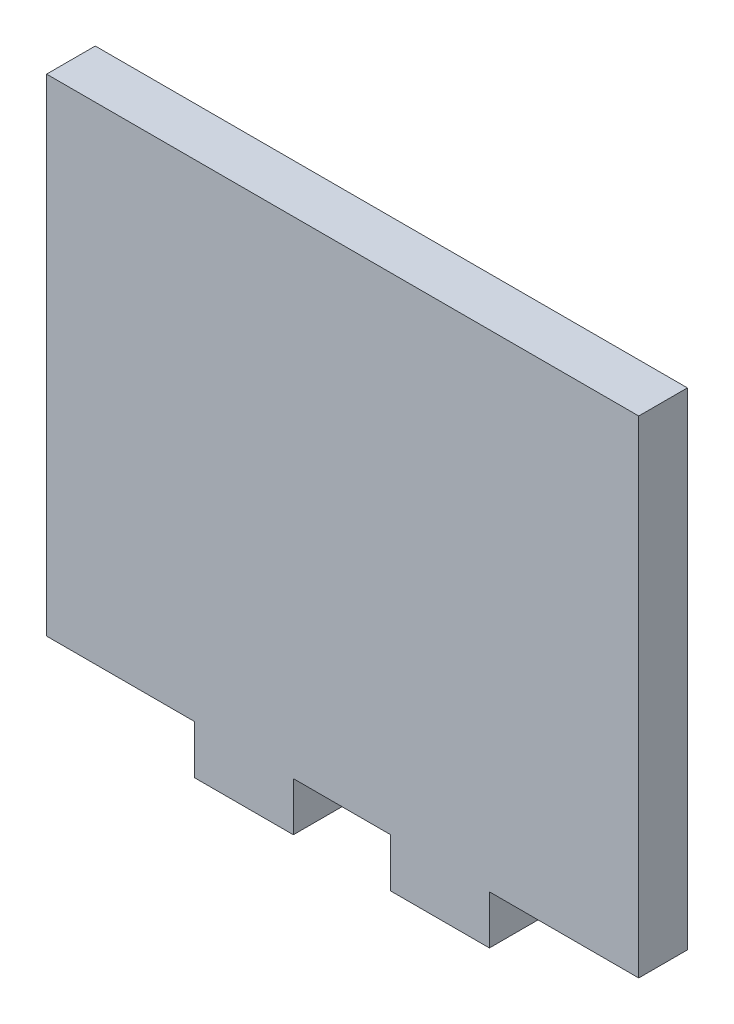
ISO-10303-21;
HEADER;
FILE_DESCRIPTION(('STEP AP214'),'2;1');
FILE_NAME('part.step','',(''),(''),'','','');
FILE_SCHEMA(('AUTOMOTIVE_DESIGN { 1 0 10303 214 1 1 1 1 }'));
ENDSEC;
DATA;
#1=APPLICATION_CONTEXT('core data for automotive mechanical design processes');
#2=APPLICATION_PROTOCOL_DEFINITION('international standard','automotive_design',2000,#1);
#3=PRODUCT_CONTEXT('',#1,'mechanical');
#4=PRODUCT('Part','Part','',(#3));
#5=PRODUCT_RELATED_PRODUCT_CATEGORY('part','',(#4));
#6=PRODUCT_DEFINITION_FORMATION('','',#4);
#7=PRODUCT_DEFINITION_CONTEXT('part definition',#1,'design');
#8=PRODUCT_DEFINITION('design','',#6,#7);
#9=PRODUCT_DEFINITION_SHAPE('','',#8);
#10=(LENGTH_UNIT() NAMED_UNIT(*) SI_UNIT(.MILLI.,.METRE.));
#11=(NAMED_UNIT(*) PLANE_ANGLE_UNIT() SI_UNIT($,.RADIAN.));
#12=(NAMED_UNIT(*) SI_UNIT($,.STERADIAN.) SOLID_ANGLE_UNIT());
#13=UNCERTAINTY_MEASURE_WITH_UNIT(LENGTH_MEASURE(1.E-05),#10,'distance_accuracy_value','');
#14=(GEOMETRIC_REPRESENTATION_CONTEXT(3) GLOBAL_UNCERTAINTY_ASSIGNED_CONTEXT((#13)) GLOBAL_UNIT_ASSIGNED_CONTEXT((#10,
#11,#12)) REPRESENTATION_CONTEXT('',''));
#15=CARTESIAN_POINT('',(0.,0.,0.));
#16=DIRECTION('',(0.,0.,1.));
#17=DIRECTION('',(1.,0.,0.));
#18=AXIS2_PLACEMENT_3D('',#15,#16,#17);
#19=CARTESIAN_POINT('',(-13.0644496304591,50.,5.));
#20=DIRECTION('',(1.,0.,0.));
#21=DIRECTION('',(0.,1.,0.));
#22=AXIS2_PLACEMENT_3D('',#19,#20,#21);
#23=PLANE('',#22);
#24=DIRECTION('',(0.,-1.,0.));
#25=VECTOR('',#24,1.);
#26=CARTESIAN_POINT('',(-13.0644496304591,50.,0.));
#27=LINE('',#26,#25);
#28=CARTESIAN_POINT('',(-13.0644496304591,50.,0.));
#29=VERTEX_POINT('',#28);
#30=CARTESIAN_POINT('',(-13.0644496304591,0.,0.));
#31=VERTEX_POINT('',#30);
#32=EDGE_CURVE('E153',#29,#31,#27,.T.);
#33=ORIENTED_EDGE('',*,*,#32,.T.);
#34=DIRECTION('',(0.,0.,-1.));
#35=VECTOR('',#34,1.);
#36=CARTESIAN_POINT('',(-13.0644496304591,0.,5.));
#37=LINE('',#36,#35);
#38=CARTESIAN_POINT('',(-13.0644496304591,0.,5.));
#39=VERTEX_POINT('',#38);
#40=EDGE_CURVE('E11',#39,#31,#37,.T.);
#41=ORIENTED_EDGE('',*,*,#40,.F.);
#42=DIRECTION('',(0.,-1.,0.));
#43=VECTOR('',#42,1.);
#44=CARTESIAN_POINT('',(-13.0644496304591,50.,5.));
#45=LINE('',#44,#43);
#46=CARTESIAN_POINT('',(-13.0644496304591,50.,5.));
#47=VERTEX_POINT('',#46);
#48=EDGE_CURVE('E175',#47,#39,#45,.T.);
#49=ORIENTED_EDGE('',*,*,#48,.F.);
#50=DIRECTION('',(0.,0.,-1.));
#51=VECTOR('',#50,1.);
#52=CARTESIAN_POINT('',(-13.0644496304591,50.,5.));
#53=LINE('',#52,#51);
#54=EDGE_CURVE('E149',#47,#29,#53,.T.);
#55=ORIENTED_EDGE('',*,*,#54,.T.);
#56=EDGE_LOOP('',(#33,#41,#49,#55));
#57=FACE_BOUND('',#56,.T.);
#58=ADVANCED_FACE('F33',(#57),#23,.F.);
#59=CARTESIAN_POINT('',(-13.0644496304591,0.,5.));
#60=DIRECTION('',(0.,1.,0.));
#61=DIRECTION('',(0.,0.,1.));
#62=AXIS2_PLACEMENT_3D('',#59,#60,#61);
#63=PLANE('',#62);
#64=DIRECTION('',(1.,0.,0.));
#65=VECTOR('',#64,1.);
#66=CARTESIAN_POINT('',(-13.0644496304591,0.,0.));
#67=LINE('',#66,#65);
#68=CARTESIAN_POINT('',(2.14555036954092,0.,0.));
#69=VERTEX_POINT('',#68);
#70=EDGE_CURVE('E156',#31,#69,#67,.T.);
#71=ORIENTED_EDGE('',*,*,#70,.T.);
#72=DIRECTION('',(0.,0.,-1.));
#73=VECTOR('',#72,1.);
#74=CARTESIAN_POINT('',(2.14555036954092,0.,5.));
#75=LINE('',#74,#73);
#76=CARTESIAN_POINT('',(2.14555036954092,0.,5.));
#77=VERTEX_POINT('',#76);
#78=EDGE_CURVE('E41',#77,#69,#75,.T.);
#79=ORIENTED_EDGE('',*,*,#78,.F.);
#80=DIRECTION('',(1.,0.,0.));
#81=VECTOR('',#80,1.);
#82=CARTESIAN_POINT('',(-13.0644496304591,0.,5.));
#83=LINE('',#82,#81);
#84=EDGE_CURVE('E104',#39,#77,#83,.T.);
#85=ORIENTED_EDGE('',*,*,#84,.F.);
#86=ORIENTED_EDGE('',*,*,#40,.T.);
#87=EDGE_LOOP('',(#71,#79,#85,#86));
#88=FACE_BOUND('',#87,.T.);
#89=ADVANCED_FACE('F253',(#88),#63,.F.);
#90=CARTESIAN_POINT('',(2.14555036954092,0.,5.));
#91=DIRECTION('',(1.,0.,0.));
#92=DIRECTION('',(0.,1.,0.));
#93=AXIS2_PLACEMENT_3D('',#90,#91,#92);
#94=PLANE('',#93);
#95=DIRECTION('',(0.,-1.,0.));
#96=VECTOR('',#95,1.);
#97=CARTESIAN_POINT('',(2.14555036954092,0.,0.));
#98=LINE('',#97,#96);
#99=CARTESIAN_POINT('',(2.14555036954092,-5.,0.));
#100=VERTEX_POINT('',#99);
#101=EDGE_CURVE('E158',#69,#100,#98,.T.);
#102=ORIENTED_EDGE('',*,*,#101,.T.);
#103=DIRECTION('',(0.,0.,-1.));
#104=VECTOR('',#103,1.);
#105=CARTESIAN_POINT('',(2.14555036954092,-5.,5.));
#106=LINE('',#105,#104);
#107=CARTESIAN_POINT('',(2.14555036954092,-5.,5.));
#108=VERTEX_POINT('',#107);
#109=EDGE_CURVE('E194',#108,#100,#106,.T.);
#110=ORIENTED_EDGE('',*,*,#109,.F.);
#111=DIRECTION('',(0.,-1.,0.));
#112=VECTOR('',#111,1.);
#113=CARTESIAN_POINT('',(2.14555036954092,0.,5.));
#114=LINE('',#113,#112);
#115=EDGE_CURVE('E202',#77,#108,#114,.T.);
#116=ORIENTED_EDGE('',*,*,#115,.F.);
#117=ORIENTED_EDGE('',*,*,#78,.T.);
#118=EDGE_LOOP('',(#102,#110,#116,#117));
#119=FACE_BOUND('',#118,.T.);
#120=ADVANCED_FACE('F200',(#119),#94,.F.);
#121=CARTESIAN_POINT('',(2.14555036954092,-5.,5.));
#122=DIRECTION('',(0.,1.,0.));
#123=DIRECTION('',(-1.,0.,0.));
#124=AXIS2_PLACEMENT_3D('',#121,#122,#123);
#125=PLANE('',#124);
#126=DIRECTION('',(1.,0.,0.));
#127=VECTOR('',#126,1.);
#128=CARTESIAN_POINT('',(2.14555036954092,-5.,0.));
#129=LINE('',#128,#127);
#130=CARTESIAN_POINT('',(12.2855503695409,-5.,0.));
#131=VERTEX_POINT('',#130);
#132=EDGE_CURVE('E160',#100,#131,#129,.T.);
#133=ORIENTED_EDGE('',*,*,#132,.T.);
#134=DIRECTION('',(0.,0.,-1.));
#135=VECTOR('',#134,1.);
#136=CARTESIAN_POINT('',(12.2855503695409,-5.,5.));
#137=LINE('',#136,#135);
#138=CARTESIAN_POINT('',(12.2855503695409,-5.,5.));
#139=VERTEX_POINT('',#138);
#140=EDGE_CURVE('E191',#139,#131,#137,.T.);
#141=ORIENTED_EDGE('',*,*,#140,.F.);
#142=DIRECTION('',(1.,0.,0.));
#143=VECTOR('',#142,1.);
#144=CARTESIAN_POINT('',(2.14555036954092,-5.,5.));
#145=LINE('',#144,#143);
#146=EDGE_CURVE('E220',#108,#139,#145,.T.);
#147=ORIENTED_EDGE('',*,*,#146,.F.);
#148=ORIENTED_EDGE('',*,*,#109,.T.);
#149=EDGE_LOOP('',(#133,#141,#147,#148));
#150=FACE_BOUND('',#149,.T.);
#151=ADVANCED_FACE('F211',(#150),#125,.F.);
#152=CARTESIAN_POINT('',(12.2855503695409,-5.,5.));
#153=DIRECTION('',(-1.,0.,0.));
#154=DIRECTION('',(0.,-1.,0.));
#155=AXIS2_PLACEMENT_3D('',#152,#153,#154);
#156=PLANE('',#155);
#157=DIRECTION('',(0.,1.,0.));
#158=VECTOR('',#157,1.);
#159=CARTESIAN_POINT('',(12.2855503695409,-5.,0.));
#160=LINE('',#159,#158);
#161=CARTESIAN_POINT('',(12.2855503695409,0.,0.));
#162=VERTEX_POINT('',#161);
#163=EDGE_CURVE('E162',#131,#162,#160,.T.);
#164=ORIENTED_EDGE('',*,*,#163,.T.);
#165=DIRECTION('',(0.,0.,-1.));
#166=VECTOR('',#165,1.);
#167=CARTESIAN_POINT('',(12.2855503695409,0.,5.));
#168=LINE('',#167,#166);
#169=CARTESIAN_POINT('',(12.2855503695409,0.,5.));
#170=VERTEX_POINT('',#169);
#171=EDGE_CURVE('E188',#170,#162,#168,.T.);
#172=ORIENTED_EDGE('',*,*,#171,.F.);
#173=DIRECTION('',(0.,1.,0.));
#174=VECTOR('',#173,1.);
#175=CARTESIAN_POINT('',(12.2855503695409,-5.,5.));
#176=LINE('',#175,#174);
#177=EDGE_CURVE('E217',#139,#170,#176,.T.);
#178=ORIENTED_EDGE('',*,*,#177,.F.);
#179=ORIENTED_EDGE('',*,*,#140,.T.);
#180=EDGE_LOOP('',(#164,#172,#178,#179));
#181=FACE_BOUND('',#180,.T.);
#182=ADVANCED_FACE('F215',(#181),#156,.F.);
#183=CARTESIAN_POINT('',(12.2855503695409,0.,5.));
#184=DIRECTION('',(0.,1.,0.));
#185=DIRECTION('',(0.,0.,1.));
#186=AXIS2_PLACEMENT_3D('',#183,#184,#185);
#187=PLANE('',#186);
#188=DIRECTION('',(1.,0.,0.));
#189=VECTOR('',#188,1.);
#190=CARTESIAN_POINT('',(12.2855503695409,0.,0.));
#191=LINE('',#190,#189);
#192=CARTESIAN_POINT('',(22.2855503695409,0.,0.));
#193=VERTEX_POINT('',#192);
#194=EDGE_CURVE('E164',#162,#193,#191,.T.);
#195=ORIENTED_EDGE('',*,*,#194,.T.);
#196=DIRECTION('',(0.,0.,-1.));
#197=VECTOR('',#196,1.);
#198=CARTESIAN_POINT('',(22.2855503695409,0.,5.));
#199=LINE('',#198,#197);
#200=CARTESIAN_POINT('',(22.2855503695409,0.,5.));
#201=VERTEX_POINT('',#200);
#202=EDGE_CURVE('E185',#201,#193,#199,.T.);
#203=ORIENTED_EDGE('',*,*,#202,.F.);
#204=DIRECTION('',(1.,0.,0.));
#205=VECTOR('',#204,1.);
#206=CARTESIAN_POINT('',(12.2855503695409,0.,5.));
#207=LINE('',#206,#205);
#208=EDGE_CURVE('E219',#170,#201,#207,.T.);
#209=ORIENTED_EDGE('',*,*,#208,.F.);
#210=ORIENTED_EDGE('',*,*,#171,.T.);
#211=EDGE_LOOP('',(#195,#203,#209,#210));
#212=FACE_BOUND('',#211,.T.);
#213=ADVANCED_FACE('F266',(#212),#187,.F.);
#214=CARTESIAN_POINT('',(22.2855503695409,0.,5.));
#215=DIRECTION('',(1.,0.,0.));
#216=DIRECTION('',(0.,0.,-1.));
#217=AXIS2_PLACEMENT_3D('',#214,#215,#216);
#218=PLANE('',#217);
#219=DIRECTION('',(0.,-1.,0.));
#220=VECTOR('',#219,1.);
#221=CARTESIAN_POINT('',(22.2855503695409,0.,0.));
#222=LINE('',#221,#220);
#223=CARTESIAN_POINT('',(22.2855503695409,-5.,0.));
#224=VERTEX_POINT('',#223);
#225=EDGE_CURVE('E166',#193,#224,#222,.T.);
#226=ORIENTED_EDGE('',*,*,#225,.T.);
#227=DIRECTION('',(0.,0.,-1.));
#228=VECTOR('',#227,1.);
#229=CARTESIAN_POINT('',(22.2855503695409,-5.,5.));
#230=LINE('',#229,#228);
#231=CARTESIAN_POINT('',(22.2855503695409,-5.,5.));
#232=VERTEX_POINT('',#231);
#233=EDGE_CURVE('E182',#232,#224,#230,.T.);
#234=ORIENTED_EDGE('',*,*,#233,.F.);
#235=DIRECTION('',(0.,-1.,0.));
#236=VECTOR('',#235,1.);
#237=CARTESIAN_POINT('',(22.2855503695409,0.,5.));
#238=LINE('',#237,#236);
#239=EDGE_CURVE('E222',#201,#232,#238,.T.);
#240=ORIENTED_EDGE('',*,*,#239,.F.);
#241=ORIENTED_EDGE('',*,*,#202,.T.);
#242=EDGE_LOOP('',(#226,#234,#240,#241));
#243=FACE_BOUND('',#242,.T.);
#244=ADVANCED_FACE('F269',(#243),#218,.F.);
#245=CARTESIAN_POINT('',(22.2855503695409,-5.,5.));
#246=DIRECTION('',(0.,1.,0.));
#247=DIRECTION('',(0.,0.,1.));
#248=AXIS2_PLACEMENT_3D('',#245,#246,#247);
#249=PLANE('',#248);
#250=DIRECTION('',(1.,0.,0.));
#251=VECTOR('',#250,1.);
#252=CARTESIAN_POINT('',(22.2855503695409,-5.,0.));
#253=LINE('',#252,#251);
#254=CARTESIAN_POINT('',(32.4255503695409,-5.,0.));
#255=VERTEX_POINT('',#254);
#256=EDGE_CURVE('E168',#224,#255,#253,.T.);
#257=ORIENTED_EDGE('',*,*,#256,.T.);
#258=DIRECTION('',(0.,0.,-1.));
#259=VECTOR('',#258,1.);
#260=CARTESIAN_POINT('',(32.4255503695409,-5.,5.));
#261=LINE('',#260,#259);
#262=CARTESIAN_POINT('',(32.4255503695409,-5.,5.));
#263=VERTEX_POINT('',#262);
#264=EDGE_CURVE('E179',#263,#255,#261,.T.);
#265=ORIENTED_EDGE('',*,*,#264,.F.);
#266=DIRECTION('',(1.,0.,0.));
#267=VECTOR('',#266,1.);
#268=CARTESIAN_POINT('',(22.2855503695409,-5.,5.));
#269=LINE('',#268,#267);
#270=EDGE_CURVE('E228',#232,#263,#269,.T.);
#271=ORIENTED_EDGE('',*,*,#270,.F.);
#272=ORIENTED_EDGE('',*,*,#233,.T.);
#273=EDGE_LOOP('',(#257,#265,#271,#272));
#274=FACE_BOUND('',#273,.T.);
#275=ADVANCED_FACE('F234',(#274),#249,.F.);
#276=CARTESIAN_POINT('',(32.4255503695409,-5.,5.));
#277=DIRECTION('',(-1.,0.,0.));
#278=DIRECTION('',(0.,0.,1.));
#279=AXIS2_PLACEMENT_3D('',#276,#277,#278);
#280=PLANE('',#279);
#281=DIRECTION('',(0.,1.,0.));
#282=VECTOR('',#281,1.);
#283=CARTESIAN_POINT('',(32.4255503695409,-5.,0.));
#284=LINE('',#283,#282);
#285=CARTESIAN_POINT('',(32.4255503695409,0.,0.));
#286=VERTEX_POINT('',#285);
#287=EDGE_CURVE('E170',#255,#286,#284,.T.);
#288=ORIENTED_EDGE('',*,*,#287,.T.);
#289=DIRECTION('',(0.,0.,-1.));
#290=VECTOR('',#289,1.);
#291=CARTESIAN_POINT('',(32.4255503695409,0.,5.));
#292=LINE('',#291,#290);
#293=CARTESIAN_POINT('',(32.4255503695409,0.,5.));
#294=VERTEX_POINT('',#293);
#295=EDGE_CURVE('E144',#294,#286,#292,.T.);
#296=ORIENTED_EDGE('',*,*,#295,.F.);
#297=DIRECTION('',(0.,1.,0.));
#298=VECTOR('',#297,1.);
#299=CARTESIAN_POINT('',(32.4255503695409,-5.,5.));
#300=LINE('',#299,#298);
#301=EDGE_CURVE('E135',#263,#294,#300,.T.);
#302=ORIENTED_EDGE('',*,*,#301,.F.);
#303=ORIENTED_EDGE('',*,*,#264,.T.);
#304=EDGE_LOOP('',(#288,#296,#302,#303));
#305=FACE_BOUND('',#304,.T.);
#306=ADVANCED_FACE('F238',(#305),#280,.F.);
#307=CARTESIAN_POINT('',(32.4255503695409,0.,5.));
#308=DIRECTION('',(0.,1.,0.));
#309=DIRECTION('',(-1.,0.,0.));
#310=AXIS2_PLACEMENT_3D('',#307,#308,#309);
#311=PLANE('',#310);
#312=DIRECTION('',(1.,0.,0.));
#313=VECTOR('',#312,1.);
#314=CARTESIAN_POINT('',(32.4255503695409,0.,0.));
#315=LINE('',#314,#313);
#316=CARTESIAN_POINT('',(47.7655503695409,0.,0.));
#317=VERTEX_POINT('',#316);
#318=EDGE_CURVE('E143',#286,#317,#315,.T.);
#319=ORIENTED_EDGE('',*,*,#318,.T.);
#320=DIRECTION('',(0.,0.,-1.));
#321=VECTOR('',#320,1.);
#322=CARTESIAN_POINT('',(47.7655503695409,0.,5.));
#323=LINE('',#322,#321);
#324=CARTESIAN_POINT('',(47.7655503695409,0.,5.));
#325=VERTEX_POINT('',#324);
#326=EDGE_CURVE('E140',#325,#317,#323,.T.);
#327=ORIENTED_EDGE('',*,*,#326,.F.);
#328=DIRECTION('',(1.,0.,0.));
#329=VECTOR('',#328,1.);
#330=CARTESIAN_POINT('',(32.4255503695409,0.,5.));
#331=LINE('',#330,#329);
#332=EDGE_CURVE('E129',#294,#325,#331,.T.);
#333=ORIENTED_EDGE('',*,*,#332,.F.);
#334=ORIENTED_EDGE('',*,*,#295,.T.);
#335=EDGE_LOOP('',(#319,#327,#333,#334));
#336=FACE_BOUND('',#335,.T.);
#337=ADVANCED_FACE('F141',(#336),#311,.F.);
#338=CARTESIAN_POINT('',(47.7655503695409,50.,5.));
#339=DIRECTION('',(-1.,0.,0.));
#340=DIRECTION('',(0.,-1.,0.));
#341=AXIS2_PLACEMENT_3D('',#338,#339,#340);
#342=PLANE('',#341);
#343=DIRECTION('',(0.,1.,0.));
#344=VECTOR('',#343,1.);
#345=CARTESIAN_POINT('',(47.7655503695409,50.,0.));
#346=LINE('',#345,#344);
#347=CARTESIAN_POINT('',(47.7655503695409,50.,0.));
#348=VERTEX_POINT('',#347);
#349=EDGE_CURVE('E90',#317,#348,#346,.T.);
#350=ORIENTED_EDGE('',*,*,#349,.T.);
#351=DIRECTION('',(0.,0.,-1.));
#352=VECTOR('',#351,1.);
#353=CARTESIAN_POINT('',(47.7655503695409,50.,5.));
#354=LINE('',#353,#352);
#355=CARTESIAN_POINT('',(47.7655503695409,50.,5.));
#356=VERTEX_POINT('',#355);
#357=EDGE_CURVE('E145',#356,#348,#354,.T.);
#358=ORIENTED_EDGE('',*,*,#357,.F.);
#359=DIRECTION('',(0.,1.,0.));
#360=VECTOR('',#359,1.);
#361=CARTESIAN_POINT('',(47.7655503695409,50.,5.));
#362=LINE('',#361,#360);
#363=EDGE_CURVE('E133',#325,#356,#362,.T.);
#364=ORIENTED_EDGE('',*,*,#363,.F.);
#365=ORIENTED_EDGE('',*,*,#326,.T.);
#366=EDGE_LOOP('',(#350,#358,#364,#365));
#367=FACE_BOUND('',#366,.T.);
#368=ADVANCED_FACE('F147',(#367),#342,.F.);
#369=CARTESIAN_POINT('',(-13.0644496304591,50.,5.));
#370=DIRECTION('',(0.,-1.,0.));
#371=DIRECTION('',(0.,0.,-1.));
#372=AXIS2_PLACEMENT_3D('',#369,#370,#371);
#373=PLANE('',#372);
#374=DIRECTION('',(-1.,0.,0.));
#375=VECTOR('',#374,1.);
#376=CARTESIAN_POINT('',(-13.0644496304591,50.,0.));
#377=LINE('',#376,#375);
#378=EDGE_CURVE('E96',#348,#29,#377,.T.);
#379=ORIENTED_EDGE('',*,*,#378,.T.);
#380=ORIENTED_EDGE('',*,*,#54,.F.);
#381=DIRECTION('',(-1.,0.,0.));
#382=VECTOR('',#381,1.);
#383=CARTESIAN_POINT('',(-13.0644496304591,50.,5.));
#384=LINE('',#383,#382);
#385=EDGE_CURVE('E49',#356,#47,#384,.T.);
#386=ORIENTED_EDGE('',*,*,#385,.F.);
#387=ORIENTED_EDGE('',*,*,#357,.T.);
#388=EDGE_LOOP('',(#379,#380,#386,#387));
#389=FACE_BOUND('',#388,.T.);
#390=ADVANCED_FACE('F242',(#389),#373,.F.);
#391=CARTESIAN_POINT('',(0.,0.,5.));
#392=DIRECTION('',(0.,0.,1.));
#393=DIRECTION('',(1.,0.,0.));
#394=AXIS2_PLACEMENT_3D('',#391,#392,#393);
#395=PLANE('',#394);
#396=ORIENTED_EDGE('',*,*,#48,.T.);
#397=ORIENTED_EDGE('',*,*,#84,.T.);
#398=ORIENTED_EDGE('',*,*,#115,.T.);
#399=ORIENTED_EDGE('',*,*,#146,.T.);
#400=ORIENTED_EDGE('',*,*,#177,.T.);
#401=ORIENTED_EDGE('',*,*,#208,.T.);
#402=ORIENTED_EDGE('',*,*,#239,.T.);
#403=ORIENTED_EDGE('',*,*,#270,.T.);
#404=ORIENTED_EDGE('',*,*,#301,.T.);
#405=ORIENTED_EDGE('',*,*,#332,.T.);
#406=ORIENTED_EDGE('',*,*,#363,.T.);
#407=ORIENTED_EDGE('',*,*,#385,.T.);
#408=EDGE_LOOP('',(#396,#397,#398,#399,#400,#401,#402,#403,#404,#405,#406,#407));
#409=FACE_BOUND('',#408,.T.);
#410=ADVANCED_FACE('F131',(#409),#395,.T.);
#411=CARTESIAN_POINT('',(0.,0.,0.));
#412=DIRECTION('',(0.,0.,1.));
#413=DIRECTION('',(1.,0.,0.));
#414=AXIS2_PLACEMENT_3D('',#411,#412,#413);
#415=PLANE('',#414);
#416=ORIENTED_EDGE('',*,*,#32,.F.);
#417=ORIENTED_EDGE('',*,*,#378,.F.);
#418=ORIENTED_EDGE('',*,*,#349,.F.);
#419=ORIENTED_EDGE('',*,*,#318,.F.);
#420=ORIENTED_EDGE('',*,*,#287,.F.);
#421=ORIENTED_EDGE('',*,*,#256,.F.);
#422=ORIENTED_EDGE('',*,*,#225,.F.);
#423=ORIENTED_EDGE('',*,*,#194,.F.);
#424=ORIENTED_EDGE('',*,*,#163,.F.);
#425=ORIENTED_EDGE('',*,*,#132,.F.);
#426=ORIENTED_EDGE('',*,*,#101,.F.);
#427=ORIENTED_EDGE('',*,*,#70,.F.);
#428=EDGE_LOOP('',(#416,#417,#418,#419,#420,#421,#422,#423,#424,#425,#426,#427));
#429=FACE_BOUND('',#428,.T.);
#430=ADVANCED_FACE('F206',(#429),#415,.F.);
#431=CLOSED_SHELL('',(#58,#89,#120,#151,#182,#213,#244,#275,#306,#337,#368,#390,#410,#430));
#432=MANIFOLD_SOLID_BREP('B2',#431);
#433=ADVANCED_BREP_SHAPE_REPRESENTATION('',(#18,#432),#14);
#434=SHAPE_DEFINITION_REPRESENTATION(#9,#433);
ENDSEC;
END-ISO-10303-21;
